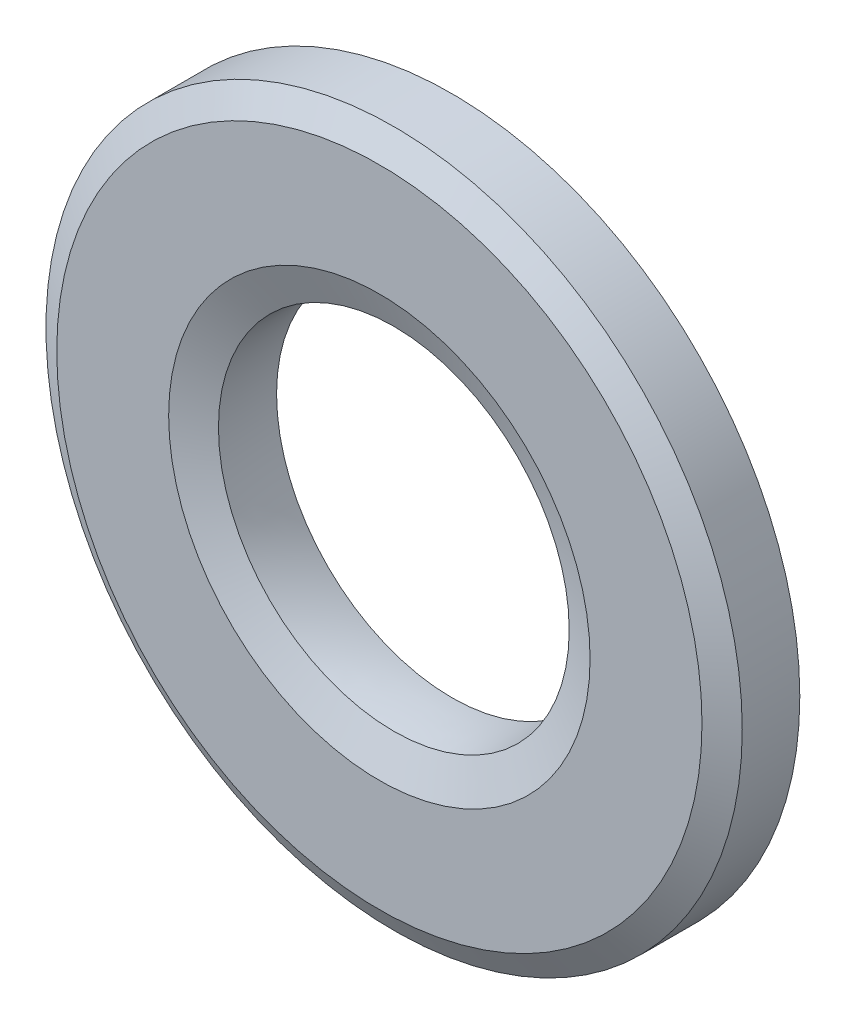
ISO-10303-21;
HEADER;
FILE_DESCRIPTION(('STEP AP214'),'2;1');
FILE_NAME('part.step','',(''),(''),'','','');
FILE_SCHEMA(('AUTOMOTIVE_DESIGN { 1 0 10303 214 1 1 1 1 }'));
ENDSEC;
DATA;
#1=APPLICATION_CONTEXT('core data for automotive mechanical design processes');
#2=APPLICATION_PROTOCOL_DEFINITION('international standard','automotive_design',2000,#1);
#3=PRODUCT_CONTEXT('',#1,'mechanical');
#4=PRODUCT('Part','Part','',(#3));
#5=PRODUCT_RELATED_PRODUCT_CATEGORY('part','',(#4));
#6=PRODUCT_DEFINITION_FORMATION('','',#4);
#7=PRODUCT_DEFINITION_CONTEXT('part definition',#1,'design');
#8=PRODUCT_DEFINITION('design','',#6,#7);
#9=PRODUCT_DEFINITION_SHAPE('','',#8);
#10=(LENGTH_UNIT() NAMED_UNIT(*) SI_UNIT(.MILLI.,.METRE.));
#11=(NAMED_UNIT(*) PLANE_ANGLE_UNIT() SI_UNIT($,.RADIAN.));
#12=(NAMED_UNIT(*) SI_UNIT($,.STERADIAN.) SOLID_ANGLE_UNIT());
#13=UNCERTAINTY_MEASURE_WITH_UNIT(LENGTH_MEASURE(1.E-05),#10,'distance_accuracy_value','');
#14=(GEOMETRIC_REPRESENTATION_CONTEXT(3) GLOBAL_UNCERTAINTY_ASSIGNED_CONTEXT((#13)) GLOBAL_UNIT_ASSIGNED_CONTEXT((#10,
#11,#12)) REPRESENTATION_CONTEXT('',''));
#15=CARTESIAN_POINT('',(0.,0.,0.));
#16=DIRECTION('',(0.,0.,1.));
#17=DIRECTION('',(1.,0.,0.));
#18=AXIS2_PLACEMENT_3D('',#15,#16,#17);
#19=CARTESIAN_POINT('',(0.,0.,0.749999999999995));
#20=DIRECTION('',(0.,0.,1.));
#21=DIRECTION('',(1.,0.,0.));
#22=AXIS2_PLACEMENT_3D('',#19,#20,#21);
#23=PLANE('',#22);
#24=CARTESIAN_POINT('',(0.,0.,0.749999999999995));
#25=DIRECTION('',(0.,0.,1.));
#26=DIRECTION('',(1.,0.,0.));
#27=AXIS2_PLACEMENT_3D('',#24,#25,#26);
#28=CIRCLE('',#27,3.63173139139107);
#29=CARTESIAN_POINT('',(3.63173139139107,0.,0.749999999999995));
#30=VERTEX_POINT('',#29);
#31=EDGE_CURVE('E10',#30,#30,#28,.F.);
#32=ORIENTED_EDGE('',*,*,#31,.T.);
#33=EDGE_LOOP('',(#32));
#34=FACE_BOUND('',#33,.T.);
#35=CARTESIAN_POINT('',(0.,0.,0.749999999999995));
#36=DIRECTION('',(0.,0.,1.));
#37=DIRECTION('',(1.,0.,0.));
#38=AXIS2_PLACEMENT_3D('',#35,#36,#37);
#39=CIRCLE('',#38,5.56005909487751);
#40=CARTESIAN_POINT('',(5.56005909487751,0.,0.749999999999995));
#41=VERTEX_POINT('',#40);
#42=EDGE_CURVE('E69',#41,#41,#39,.T.);
#43=ORIENTED_EDGE('',*,*,#42,.T.);
#44=EDGE_LOOP('',(#43));
#45=FACE_BOUND('',#44,.T.);
#46=ADVANCED_FACE('F43',(#34,#45),#23,.T.);
#47=CARTESIAN_POINT('',(0.,0.,0.749999999999995));
#48=DIRECTION('',(0.,0.,-1.));
#49=DIRECTION('',(-1.,0.,0.));
#50=AXIS2_PLACEMENT_3D('',#47,#48,#49);
#51=CYLINDRICAL_SURFACE('',#50,6.);
#52=CARTESIAN_POINT('',(0.,0.,-0.496000000000007));
#53=DIRECTION('',(0.,0.,1.));
#54=DIRECTION('',(1.,0.,0.));
#55=AXIS2_PLACEMENT_3D('',#52,#53,#54);
#56=CIRCLE('',#55,6.);
#57=CARTESIAN_POINT('',(6.,0.,-0.496000000000007));
#58=VERTEX_POINT('',#57);
#59=EDGE_CURVE('E77',#58,#58,#56,.T.);
#60=ORIENTED_EDGE('',*,*,#59,.T.);
#61=EDGE_LOOP('',(#60));
#62=FACE_BOUND('',#61,.T.);
#63=CARTESIAN_POINT('',(0.,0.,0.495999999999996));
#64=DIRECTION('',(0.,0.,1.));
#65=DIRECTION('',(1.,0.,0.));
#66=AXIS2_PLACEMENT_3D('',#63,#64,#65);
#67=CIRCLE('',#66,6.);
#68=CARTESIAN_POINT('',(6.,0.,0.495999999999996));
#69=VERTEX_POINT('',#68);
#70=EDGE_CURVE('E81',#69,#69,#67,.F.);
#71=ORIENTED_EDGE('',*,*,#70,.T.);
#72=EDGE_LOOP('',(#71));
#73=FACE_BOUND('',#72,.T.);
#74=ADVANCED_FACE('F87',(#62,#73),#51,.T.);
#75=CARTESIAN_POINT('',(0.,0.,-0.750000000000004));
#76=DIRECTION('',(0.,0.,1.));
#77=DIRECTION('',(1.,0.,0.));
#78=AXIS2_PLACEMENT_3D('',#75,#76,#77);
#79=PLANE('',#78);
#80=CARTESIAN_POINT('',(0.,0.,-0.750000000000004));
#81=DIRECTION('',(0.,0.,1.));
#82=DIRECTION('',(1.,0.,0.));
#83=AXIS2_PLACEMENT_3D('',#80,#81,#82);
#84=CIRCLE('',#83,3.63173139139108);
#85=CARTESIAN_POINT('',(3.63173139139108,0.,-0.750000000000004));
#86=VERTEX_POINT('',#85);
#87=EDGE_CURVE('E63',#86,#86,#84,.T.);
#88=ORIENTED_EDGE('',*,*,#87,.T.);
#89=EDGE_LOOP('',(#88));
#90=FACE_BOUND('',#89,.T.);
#91=CARTESIAN_POINT('',(0.,0.,-0.750000000000004));
#92=DIRECTION('',(0.,0.,1.));
#93=DIRECTION('',(1.,0.,0.));
#94=AXIS2_PLACEMENT_3D('',#91,#92,#93);
#95=CIRCLE('',#94,5.56005909487751);
#96=CARTESIAN_POINT('',(5.56005909487751,0.,-0.750000000000004));
#97=VERTEX_POINT('',#96);
#98=EDGE_CURVE('E73',#97,#97,#95,.F.);
#99=ORIENTED_EDGE('',*,*,#98,.T.);
#100=EDGE_LOOP('',(#99));
#101=FACE_BOUND('',#100,.T.);
#102=ADVANCED_FACE('F102',(#90,#101),#79,.F.);
#103=CARTESIAN_POINT('',(0.,0.,-0.496000000000007));
#104=DIRECTION('',(0.,0.,1.));
#105=DIRECTION('',(1.,0.,0.));
#106=AXIS2_PLACEMENT_3D('',#103,#104,#105);
#107=CONICAL_SURFACE('',#106,6.,1.0471975511966);
#108=ORIENTED_EDGE('',*,*,#98,.F.);
#109=EDGE_LOOP('',(#108));
#110=FACE_BOUND('',#109,.T.);
#111=ORIENTED_EDGE('',*,*,#59,.F.);
#112=EDGE_LOOP('',(#111));
#113=FACE_BOUND('',#112,.T.);
#114=ADVANCED_FACE('F93',(#110,#113),#107,.T.);
#115=CARTESIAN_POINT('',(0.,0.,0.749999999999995));
#116=DIRECTION('',(0.,0.,-1.));
#117=DIRECTION('',(-1.,0.,0.));
#118=AXIS2_PLACEMENT_3D('',#115,#116,#117);
#119=CONICAL_SURFACE('',#118,5.56005909487751,1.0471975511966);
#120=ORIENTED_EDGE('',*,*,#70,.F.);
#121=EDGE_LOOP('',(#120));
#122=FACE_BOUND('',#121,.T.);
#123=ORIENTED_EDGE('',*,*,#42,.F.);
#124=EDGE_LOOP('',(#123));
#125=FACE_BOUND('',#124,.T.);
#126=ADVANCED_FACE('F89',(#122,#125),#119,.T.);
#127=CARTESIAN_POINT('',(0.,0.,0.));
#128=DIRECTION('',(0.,0.,1.));
#129=DIRECTION('',(0.,-1.,0.));
#130=AXIS2_PLACEMENT_3D('',#127,#128,#129);
#131=TOROIDAL_SURFACE('',#130,8.56181732283458,5.56181732283458);
#132=CARTESIAN_POINT('',(0.,0.,-0.500792333691823));
#133=DIRECTION('',(0.,0.,1.));
#134=DIRECTION('',(1.,0.,0.));
#135=AXIS2_PLACEMENT_3D('',#132,#133,#134);
#136=CIRCLE('',#135,3.02259183806703);
#137=CARTESIAN_POINT('',(3.02259183806703,0.,-0.500792333691823));
#138=VERTEX_POINT('',#137);
#139=EDGE_CURVE('E51',#138,#138,#136,.F.);
#140=ORIENTED_EDGE('',*,*,#139,.T.);
#141=EDGE_LOOP('',(#140));
#142=FACE_BOUND('',#141,.T.);
#143=CARTESIAN_POINT('',(0.,0.,0.500792333691818));
#144=DIRECTION('',(0.,0.,-1.));
#145=DIRECTION('',(-1.,0.,0.));
#146=AXIS2_PLACEMENT_3D('',#143,#144,#145);
#147=CIRCLE('',#146,3.02259183806703);
#148=CARTESIAN_POINT('',(-3.02259183806703,0.,0.500792333691818));
#149=VERTEX_POINT('',#148);
#150=EDGE_CURVE('E57',#149,#149,#147,.F.);
#151=ORIENTED_EDGE('',*,*,#150,.T.);
#152=EDGE_LOOP('',(#151));
#153=FACE_BOUND('',#152,.T.);
#154=ADVANCED_FACE('F92',(#142,#153),#131,.T.);
#155=CARTESIAN_POINT('',(0.,0.,-0.750000000000004));
#156=DIRECTION('',(0.,0.,-1.));
#157=DIRECTION('',(-1.,0.,0.));
#158=AXIS2_PLACEMENT_3D('',#155,#156,#157);
#159=CONICAL_SURFACE('',#158,3.63173139139108,1.18245762140181);
#160=ORIENTED_EDGE('',*,*,#139,.F.);
#161=EDGE_LOOP('',(#160));
#162=FACE_BOUND('',#161,.T.);
#163=ORIENTED_EDGE('',*,*,#87,.F.);
#164=EDGE_LOOP('',(#163));
#165=FACE_BOUND('',#164,.T.);
#166=ADVANCED_FACE('F110',(#162,#165),#159,.F.);
#167=CARTESIAN_POINT('',(0.,0.,0.500792333691818));
#168=DIRECTION('',(0.,0.,1.));
#169=DIRECTION('',(1.,0.,0.));
#170=AXIS2_PLACEMENT_3D('',#167,#168,#169);
#171=CONICAL_SURFACE('',#170,3.02259183806703,1.18245762140181);
#172=ORIENTED_EDGE('',*,*,#31,.F.);
#173=EDGE_LOOP('',(#172));
#174=FACE_BOUND('',#173,.T.);
#175=ORIENTED_EDGE('',*,*,#150,.F.);
#176=EDGE_LOOP('',(#175));
#177=FACE_BOUND('',#176,.T.);
#178=ADVANCED_FACE('F45',(#174,#177),#171,.F.);
#179=CLOSED_SHELL('',(#46,#74,#102,#114,#126,#154,#166,#178));
#180=MANIFOLD_SOLID_BREP('B2',#179);
#181=ADVANCED_BREP_SHAPE_REPRESENTATION('',(#18,#180),#14);
#182=SHAPE_DEFINITION_REPRESENTATION(#9,#181);
ENDSEC;
END-ISO-10303-21;
